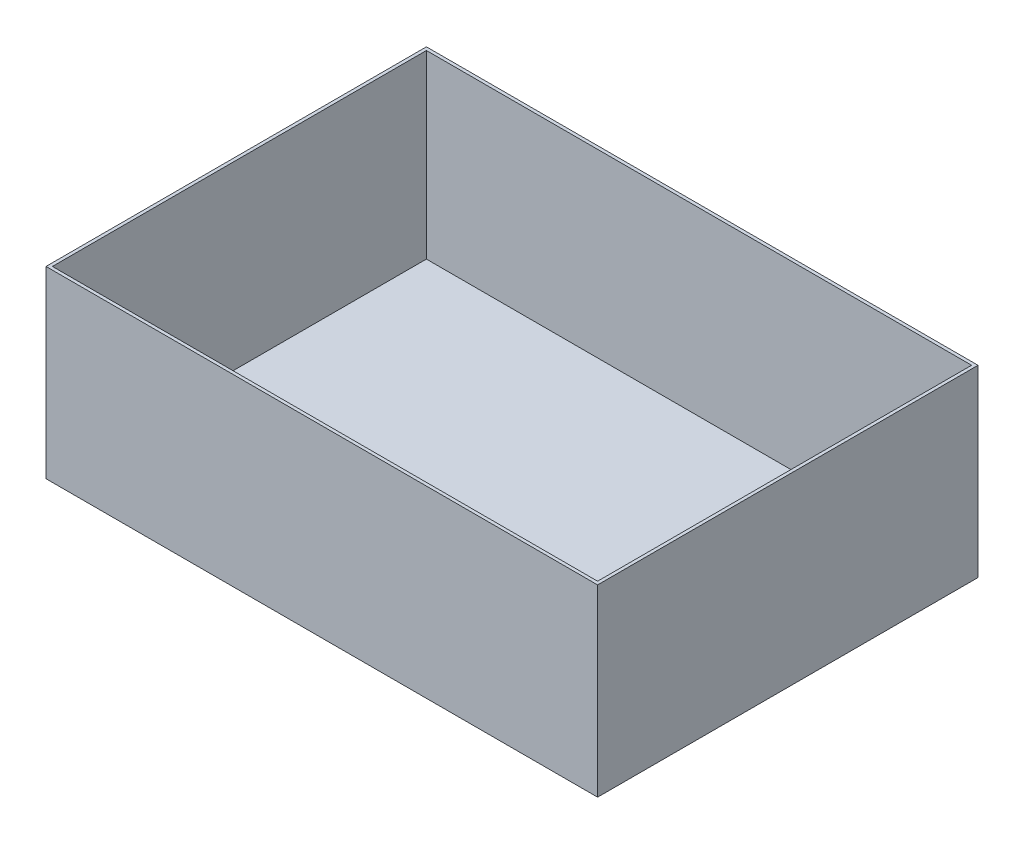
ISO-10303-21;
HEADER;
FILE_DESCRIPTION(('STEP AP214'),'2;1');
FILE_NAME('part.step','',(''),(''),'','','');
FILE_SCHEMA(('AUTOMOTIVE_DESIGN { 1 0 10303 214 1 1 1 1 }'));
ENDSEC;
DATA;
#1=APPLICATION_CONTEXT('core data for automotive mechanical design processes');
#2=APPLICATION_PROTOCOL_DEFINITION('international standard','automotive_design',2000,#1);
#3=PRODUCT_CONTEXT('',#1,'mechanical');
#4=PRODUCT('Part','Part','',(#3));
#5=PRODUCT_RELATED_PRODUCT_CATEGORY('part','',(#4));
#6=PRODUCT_DEFINITION_FORMATION('','',#4);
#7=PRODUCT_DEFINITION_CONTEXT('part definition',#1,'design');
#8=PRODUCT_DEFINITION('design','',#6,#7);
#9=PRODUCT_DEFINITION_SHAPE('','',#8);
#10=(LENGTH_UNIT() NAMED_UNIT(*) SI_UNIT(.MILLI.,.METRE.));
#11=(NAMED_UNIT(*) PLANE_ANGLE_UNIT() SI_UNIT($,.RADIAN.));
#12=(NAMED_UNIT(*) SI_UNIT($,.STERADIAN.) SOLID_ANGLE_UNIT());
#13=UNCERTAINTY_MEASURE_WITH_UNIT(LENGTH_MEASURE(1.E-05),#10,'distance_accuracy_value','');
#14=(GEOMETRIC_REPRESENTATION_CONTEXT(3) GLOBAL_UNCERTAINTY_ASSIGNED_CONTEXT((#13)) GLOBAL_UNIT_ASSIGNED_CONTEXT((#10,
#11,#12)) REPRESENTATION_CONTEXT('',''));
#15=CARTESIAN_POINT('',(0.,0.,0.));
#16=DIRECTION('',(0.,0.,1.));
#17=DIRECTION('',(1.,0.,0.));
#18=AXIS2_PLACEMENT_3D('',#15,#16,#17);
#19=CARTESIAN_POINT('',(0.,184.15,0.));
#20=DIRECTION('',(0.,-1.,0.));
#21=DIRECTION('',(0.,0.,-1.));
#22=AXIS2_PLACEMENT_3D('',#19,#20,#21);
#23=PLANE('',#22);
#24=DIRECTION('',(0.,0.,-1.));
#25=VECTOR('',#24,1.);
#26=CARTESIAN_POINT('',(276.225,184.15,190.5));
#27=LINE('',#26,#25);
#28=CARTESIAN_POINT('',(276.225,184.15,190.5));
#29=VERTEX_POINT('',#28);
#30=CARTESIAN_POINT('',(276.225,184.15,-190.5));
#31=VERTEX_POINT('',#30);
#32=EDGE_CURVE('E148',#29,#31,#27,.T.);
#33=ORIENTED_EDGE('',*,*,#32,.T.);
#34=DIRECTION('',(-1.,0.,0.));
#35=VECTOR('',#34,1.);
#36=CARTESIAN_POINT('',(-276.225,184.15,-190.5));
#37=LINE('',#36,#35);
#38=CARTESIAN_POINT('',(-276.225,184.15,-190.5));
#39=VERTEX_POINT('',#38);
#40=EDGE_CURVE('E92',#31,#39,#37,.T.);
#41=ORIENTED_EDGE('',*,*,#40,.T.);
#42=DIRECTION('',(0.,0.,1.));
#43=VECTOR('',#42,1.);
#44=CARTESIAN_POINT('',(-276.225,184.15,190.5));
#45=LINE('',#44,#43);
#46=CARTESIAN_POINT('',(-276.225,184.15,190.5));
#47=VERTEX_POINT('',#46);
#48=EDGE_CURVE('E151',#39,#47,#45,.T.);
#49=ORIENTED_EDGE('',*,*,#48,.T.);
#50=DIRECTION('',(1.,0.,0.));
#51=VECTOR('',#50,1.);
#52=CARTESIAN_POINT('',(-276.225,184.15,190.5));
#53=LINE('',#52,#51);
#54=EDGE_CURVE('E64',#47,#29,#53,.T.);
#55=ORIENTED_EDGE('',*,*,#54,.T.);
#56=EDGE_LOOP('',(#33,#41,#49,#55));
#57=FACE_BOUND('',#56,.T.);
#58=DIRECTION('',(0.,0.,-1.));
#59=VECTOR('',#58,1.);
#60=CARTESIAN_POINT('',(273.025,184.15,0.));
#61=LINE('',#60,#59);
#62=CARTESIAN_POINT('',(273.025,184.15,187.3));
#63=VERTEX_POINT('',#62);
#64=CARTESIAN_POINT('',(273.025,184.15,-187.3));
#65=VERTEX_POINT('',#64);
#66=EDGE_CURVE('E137',#63,#65,#61,.T.);
#67=ORIENTED_EDGE('',*,*,#66,.F.);
#68=DIRECTION('',(1.,0.,0.));
#69=VECTOR('',#68,1.);
#70=CARTESIAN_POINT('',(0.,184.15,187.3));
#71=LINE('',#70,#69);
#72=CARTESIAN_POINT('',(-273.025,184.15,187.3));
#73=VERTEX_POINT('',#72);
#74=EDGE_CURVE('E146',#73,#63,#71,.T.);
#75=ORIENTED_EDGE('',*,*,#74,.F.);
#76=DIRECTION('',(0.,0.,1.));
#77=VECTOR('',#76,1.);
#78=CARTESIAN_POINT('',(-273.025,184.15,0.));
#79=LINE('',#78,#77);
#80=CARTESIAN_POINT('',(-273.025,184.15,-187.3));
#81=VERTEX_POINT('',#80);
#82=EDGE_CURVE('E144',#81,#73,#79,.T.);
#83=ORIENTED_EDGE('',*,*,#82,.F.);
#84=DIRECTION('',(-1.,0.,0.));
#85=VECTOR('',#84,1.);
#86=CARTESIAN_POINT('',(0.,184.15,-187.3));
#87=LINE('',#86,#85);
#88=EDGE_CURVE('E129',#65,#81,#87,.T.);
#89=ORIENTED_EDGE('',*,*,#88,.F.);
#90=EDGE_LOOP('',(#67,#75,#83,#89));
#91=FACE_BOUND('',#90,.T.);
#92=ADVANCED_FACE('F40',(#57,#91),#23,.F.);
#93=CARTESIAN_POINT('',(276.225,184.15,190.5));
#94=DIRECTION('',(-1.,0.,0.));
#95=DIRECTION('',(0.,0.,1.));
#96=AXIS2_PLACEMENT_3D('',#93,#94,#95);
#97=PLANE('',#96);
#98=DIRECTION('',(0.,0.,-1.));
#99=VECTOR('',#98,1.);
#100=CARTESIAN_POINT('',(276.225,0.,190.5));
#101=LINE('',#100,#99);
#102=CARTESIAN_POINT('',(276.225,0.,190.5));
#103=VERTEX_POINT('',#102);
#104=CARTESIAN_POINT('',(276.225,0.,-190.5));
#105=VERTEX_POINT('',#104);
#106=EDGE_CURVE('E155',#103,#105,#101,.T.);
#107=ORIENTED_EDGE('',*,*,#106,.T.);
#108=DIRECTION('',(0.,-1.,0.));
#109=VECTOR('',#108,1.);
#110=CARTESIAN_POINT('',(276.225,184.15,-190.5));
#111=LINE('',#110,#109);
#112=EDGE_CURVE('E11',#31,#105,#111,.T.);
#113=ORIENTED_EDGE('',*,*,#112,.F.);
#114=ORIENTED_EDGE('',*,*,#32,.F.);
#115=DIRECTION('',(0.,-1.,0.));
#116=VECTOR('',#115,1.);
#117=CARTESIAN_POINT('',(276.225,184.15,190.5));
#118=LINE('',#117,#116);
#119=EDGE_CURVE('E154',#29,#103,#118,.T.);
#120=ORIENTED_EDGE('',*,*,#119,.T.);
#121=EDGE_LOOP('',(#107,#113,#114,#120));
#122=FACE_BOUND('',#121,.T.);
#123=ADVANCED_FACE('F42',(#122),#97,.F.);
#124=CARTESIAN_POINT('',(-276.225,184.15,-190.5));
#125=DIRECTION('',(0.,0.,1.));
#126=DIRECTION('',(1.,0.,0.));
#127=AXIS2_PLACEMENT_3D('',#124,#125,#126);
#128=PLANE('',#127);
#129=DIRECTION('',(-1.,0.,0.));
#130=VECTOR('',#129,1.);
#131=CARTESIAN_POINT('',(-276.225,0.,-190.5));
#132=LINE('',#131,#130);
#133=CARTESIAN_POINT('',(-276.225,0.,-190.5));
#134=VERTEX_POINT('',#133);
#135=EDGE_CURVE('E158',#105,#134,#132,.T.);
#136=ORIENTED_EDGE('',*,*,#135,.T.);
#137=DIRECTION('',(0.,-1.,0.));
#138=VECTOR('',#137,1.);
#139=CARTESIAN_POINT('',(-276.225,184.15,-190.5));
#140=LINE('',#139,#138);
#141=EDGE_CURVE('E48',#39,#134,#140,.T.);
#142=ORIENTED_EDGE('',*,*,#141,.F.);
#143=ORIENTED_EDGE('',*,*,#40,.F.);
#144=ORIENTED_EDGE('',*,*,#112,.T.);
#145=EDGE_LOOP('',(#136,#142,#143,#144));
#146=FACE_BOUND('',#145,.T.);
#147=ADVANCED_FACE('F187',(#146),#128,.F.);
#148=CARTESIAN_POINT('',(-276.225,184.15,190.5));
#149=DIRECTION('',(1.,0.,0.));
#150=DIRECTION('',(0.,0.,-1.));
#151=AXIS2_PLACEMENT_3D('',#148,#149,#150);
#152=PLANE('',#151);
#153=DIRECTION('',(0.,0.,1.));
#154=VECTOR('',#153,1.);
#155=CARTESIAN_POINT('',(-276.225,0.,190.5));
#156=LINE('',#155,#154);
#157=CARTESIAN_POINT('',(-276.225,0.,190.5));
#158=VERTEX_POINT('',#157);
#159=EDGE_CURVE('E160',#134,#158,#156,.T.);
#160=ORIENTED_EDGE('',*,*,#159,.T.);
#161=DIRECTION('',(0.,-1.,0.));
#162=VECTOR('',#161,1.);
#163=CARTESIAN_POINT('',(-276.225,184.15,190.5));
#164=LINE('',#163,#162);
#165=EDGE_CURVE('E164',#47,#158,#164,.T.);
#166=ORIENTED_EDGE('',*,*,#165,.F.);
#167=ORIENTED_EDGE('',*,*,#48,.F.);
#168=ORIENTED_EDGE('',*,*,#141,.T.);
#169=EDGE_LOOP('',(#160,#166,#167,#168));
#170=FACE_BOUND('',#169,.T.);
#171=ADVANCED_FACE('F169',(#170),#152,.F.);
#172=CARTESIAN_POINT('',(-276.225,184.15,190.5));
#173=DIRECTION('',(0.,0.,-1.));
#174=DIRECTION('',(-1.,0.,0.));
#175=AXIS2_PLACEMENT_3D('',#172,#173,#174);
#176=PLANE('',#175);
#177=DIRECTION('',(1.,0.,0.));
#178=VECTOR('',#177,1.);
#179=CARTESIAN_POINT('',(-276.225,0.,190.5));
#180=LINE('',#179,#178);
#181=EDGE_CURVE('E85',#158,#103,#180,.T.);
#182=ORIENTED_EDGE('',*,*,#181,.T.);
#183=ORIENTED_EDGE('',*,*,#119,.F.);
#184=ORIENTED_EDGE('',*,*,#54,.F.);
#185=ORIENTED_EDGE('',*,*,#165,.T.);
#186=EDGE_LOOP('',(#182,#183,#184,#185));
#187=FACE_BOUND('',#186,.T.);
#188=ADVANCED_FACE('F177',(#187),#176,.F.);
#189=CARTESIAN_POINT('',(0.,0.,0.));
#190=DIRECTION('',(0.,-1.,0.));
#191=DIRECTION('',(0.,0.,-1.));
#192=AXIS2_PLACEMENT_3D('',#189,#190,#191);
#193=PLANE('',#192);
#194=ORIENTED_EDGE('',*,*,#106,.F.);
#195=ORIENTED_EDGE('',*,*,#181,.F.);
#196=ORIENTED_EDGE('',*,*,#159,.F.);
#197=ORIENTED_EDGE('',*,*,#135,.F.);
#198=EDGE_LOOP('',(#194,#195,#196,#197));
#199=FACE_BOUND('',#198,.T.);
#200=ADVANCED_FACE('F173',(#199),#193,.T.);
#201=CARTESIAN_POINT('',(273.025,184.15,190.5));
#202=DIRECTION('',(-1.,0.,0.));
#203=DIRECTION('',(0.,0.,1.));
#204=AXIS2_PLACEMENT_3D('',#201,#202,#203);
#205=PLANE('',#204);
#206=DIRECTION('',(0.,0.,-1.));
#207=VECTOR('',#206,1.);
#208=CARTESIAN_POINT('',(273.025,3.2,0.));
#209=LINE('',#208,#207);
#210=CARTESIAN_POINT('',(273.025,3.2,187.3));
#211=VERTEX_POINT('',#210);
#212=CARTESIAN_POINT('',(273.025,3.2,-187.3));
#213=VERTEX_POINT('',#212);
#214=EDGE_CURVE('E120',#211,#213,#209,.T.);
#215=ORIENTED_EDGE('',*,*,#214,.F.);
#216=DIRECTION('',(0.,-1.,0.));
#217=VECTOR('',#216,1.);
#218=CARTESIAN_POINT('',(273.025,184.15,187.3));
#219=LINE('',#218,#217);
#220=EDGE_CURVE('E140',#63,#211,#219,.T.);
#221=ORIENTED_EDGE('',*,*,#220,.F.);
#222=ORIENTED_EDGE('',*,*,#66,.T.);
#223=DIRECTION('',(0.,-1.,0.));
#224=VECTOR('',#223,1.);
#225=CARTESIAN_POINT('',(273.025,184.15,-187.3));
#226=LINE('',#225,#224);
#227=EDGE_CURVE('E132',#65,#213,#226,.T.);
#228=ORIENTED_EDGE('',*,*,#227,.T.);
#229=EDGE_LOOP('',(#215,#221,#222,#228));
#230=FACE_BOUND('',#229,.T.);
#231=ADVANCED_FACE('F184',(#230),#205,.T.);
#232=CARTESIAN_POINT('',(-276.225,184.15,-187.3));
#233=DIRECTION('',(0.,0.,1.));
#234=DIRECTION('',(1.,0.,0.));
#235=AXIS2_PLACEMENT_3D('',#232,#233,#234);
#236=PLANE('',#235);
#237=DIRECTION('',(-1.,0.,0.));
#238=VECTOR('',#237,1.);
#239=CARTESIAN_POINT('',(0.,3.2,-187.3));
#240=LINE('',#239,#238);
#241=CARTESIAN_POINT('',(-273.025,3.2,-187.3));
#242=VERTEX_POINT('',#241);
#243=EDGE_CURVE('E114',#213,#242,#240,.T.);
#244=ORIENTED_EDGE('',*,*,#243,.F.);
#245=ORIENTED_EDGE('',*,*,#227,.F.);
#246=ORIENTED_EDGE('',*,*,#88,.T.);
#247=DIRECTION('',(0.,-1.,0.));
#248=VECTOR('',#247,1.);
#249=CARTESIAN_POINT('',(-273.025,184.15,-187.3));
#250=LINE('',#249,#248);
#251=EDGE_CURVE('E126',#81,#242,#250,.T.);
#252=ORIENTED_EDGE('',*,*,#251,.T.);
#253=EDGE_LOOP('',(#244,#245,#246,#252));
#254=FACE_BOUND('',#253,.T.);
#255=ADVANCED_FACE('F127',(#254),#236,.T.);
#256=CARTESIAN_POINT('',(-273.025,184.15,190.5));
#257=DIRECTION('',(1.,0.,0.));
#258=DIRECTION('',(0.,0.,-1.));
#259=AXIS2_PLACEMENT_3D('',#256,#257,#258);
#260=PLANE('',#259);
#261=DIRECTION('',(0.,0.,1.));
#262=VECTOR('',#261,1.);
#263=CARTESIAN_POINT('',(-273.025,3.2,0.));
#264=LINE('',#263,#262);
#265=CARTESIAN_POINT('',(-273.025,3.2,187.3));
#266=VERTEX_POINT('',#265);
#267=EDGE_CURVE('E118',#242,#266,#264,.T.);
#268=ORIENTED_EDGE('',*,*,#267,.F.);
#269=ORIENTED_EDGE('',*,*,#251,.F.);
#270=ORIENTED_EDGE('',*,*,#82,.T.);
#271=DIRECTION('',(0.,-1.,0.));
#272=VECTOR('',#271,1.);
#273=CARTESIAN_POINT('',(-273.025,184.15,187.3));
#274=LINE('',#273,#272);
#275=EDGE_CURVE('E55',#73,#266,#274,.T.);
#276=ORIENTED_EDGE('',*,*,#275,.T.);
#277=EDGE_LOOP('',(#268,#269,#270,#276));
#278=FACE_BOUND('',#277,.T.);
#279=ADVANCED_FACE('F134',(#278),#260,.T.);
#280=CARTESIAN_POINT('',(-276.225,184.15,187.3));
#281=DIRECTION('',(0.,0.,-1.));
#282=DIRECTION('',(-1.,0.,0.));
#283=AXIS2_PLACEMENT_3D('',#280,#281,#282);
#284=PLANE('',#283);
#285=DIRECTION('',(1.,0.,0.));
#286=VECTOR('',#285,1.);
#287=CARTESIAN_POINT('',(0.,3.2,187.3));
#288=LINE('',#287,#286);
#289=EDGE_CURVE('E135',#266,#211,#288,.T.);
#290=ORIENTED_EDGE('',*,*,#289,.F.);
#291=ORIENTED_EDGE('',*,*,#275,.F.);
#292=ORIENTED_EDGE('',*,*,#74,.T.);
#293=ORIENTED_EDGE('',*,*,#220,.T.);
#294=EDGE_LOOP('',(#290,#291,#292,#293));
#295=FACE_BOUND('',#294,.T.);
#296=ADVANCED_FACE('F197',(#295),#284,.T.);
#297=CARTESIAN_POINT('',(0.,3.2,0.));
#298=DIRECTION('',(0.,-1.,0.));
#299=DIRECTION('',(0.,0.,-1.));
#300=AXIS2_PLACEMENT_3D('',#297,#298,#299);
#301=PLANE('',#300);
#302=ORIENTED_EDGE('',*,*,#214,.T.);
#303=ORIENTED_EDGE('',*,*,#243,.T.);
#304=ORIENTED_EDGE('',*,*,#267,.T.);
#305=ORIENTED_EDGE('',*,*,#289,.T.);
#306=EDGE_LOOP('',(#302,#303,#304,#305));
#307=FACE_BOUND('',#306,.T.);
#308=ADVANCED_FACE('F116',(#307),#301,.F.);
#309=CLOSED_SHELL('',(#92,#123,#147,#171,#188,#200,#231,#255,#279,#296,#308));
#310=MANIFOLD_SOLID_BREP('B2',#309);
#311=ADVANCED_BREP_SHAPE_REPRESENTATION('',(#18,#310),#14);
#312=SHAPE_DEFINITION_REPRESENTATION(#9,#311);
ENDSEC;
END-ISO-10303-21;
